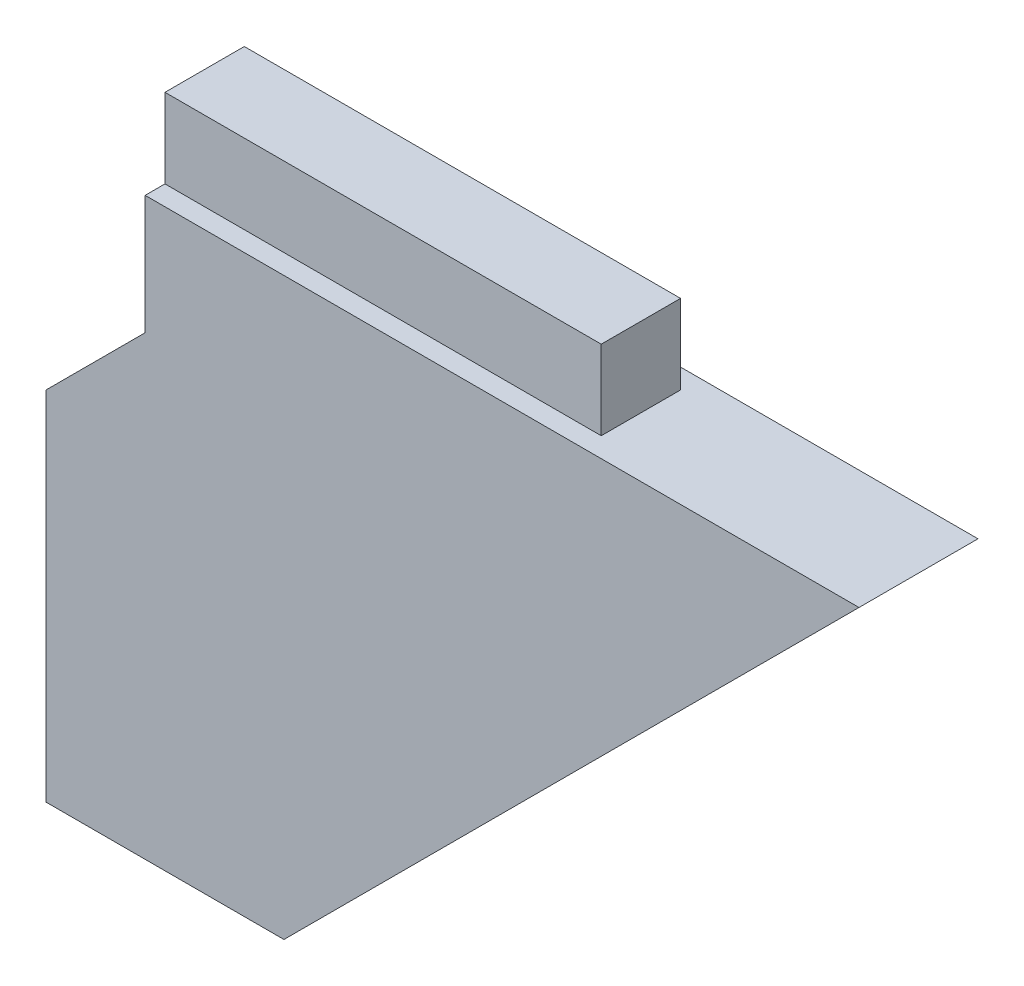
ISO-10303-21;
HEADER;
FILE_DESCRIPTION(('STEP AP214'),'2;1');
FILE_NAME('part.step','',(''),(''),'','','');
FILE_SCHEMA(('AUTOMOTIVE_DESIGN { 1 0 10303 214 1 1 1 1 }'));
ENDSEC;
DATA;
#1=APPLICATION_CONTEXT('core data for automotive mechanical design processes');
#2=APPLICATION_PROTOCOL_DEFINITION('international standard','automotive_design',2000,#1);
#3=PRODUCT_CONTEXT('',#1,'mechanical');
#4=PRODUCT('Part','Part','',(#3));
#5=PRODUCT_RELATED_PRODUCT_CATEGORY('part','',(#4));
#6=PRODUCT_DEFINITION_FORMATION('','',#4);
#7=PRODUCT_DEFINITION_CONTEXT('part definition',#1,'design');
#8=PRODUCT_DEFINITION('design','',#6,#7);
#9=PRODUCT_DEFINITION_SHAPE('','',#8);
#10=(LENGTH_UNIT() NAMED_UNIT(*) SI_UNIT(.MILLI.,.METRE.));
#11=(NAMED_UNIT(*) PLANE_ANGLE_UNIT() SI_UNIT($,.RADIAN.));
#12=(NAMED_UNIT(*) SI_UNIT($,.STERADIAN.) SOLID_ANGLE_UNIT());
#13=UNCERTAINTY_MEASURE_WITH_UNIT(LENGTH_MEASURE(1.E-05),#10,'distance_accuracy_value','');
#14=(GEOMETRIC_REPRESENTATION_CONTEXT(3) GLOBAL_UNCERTAINTY_ASSIGNED_CONTEXT((#13)) GLOBAL_UNIT_ASSIGNED_CONTEXT((#10,
#11,#12)) REPRESENTATION_CONTEXT('',''));
#15=CARTESIAN_POINT('',(0.,0.,0.));
#16=DIRECTION('',(0.,0.,1.));
#17=DIRECTION('',(1.,0.,0.));
#18=AXIS2_PLACEMENT_3D('',#15,#16,#17);
#19=CARTESIAN_POINT('',(0.,-6.00000000000003,1.5));
#20=DIRECTION('',(0.,1.,0.));
#21=DIRECTION('',(-1.,0.,0.));
#22=AXIS2_PLACEMENT_3D('',#19,#20,#21);
#23=PLANE('',#22);
#24=DIRECTION('',(0.,0.,-1.));
#25=VECTOR('',#24,1.);
#26=CARTESIAN_POINT('',(-39.5,-6.00000000000001,1.5));
#27=LINE('',#26,#25);
#28=CARTESIAN_POINT('',(-39.5,-6.00000000000001,-1.));
#29=VERTEX_POINT('',#28);
#30=CARTESIAN_POINT('',(-39.5,-6.00000000000001,-1.5));
#31=VERTEX_POINT('',#30);
#32=EDGE_CURVE('E53',#29,#31,#27,.T.);
#33=ORIENTED_EDGE('',*,*,#32,.F.);
#34=DIRECTION('',(1.,0.,0.));
#35=VECTOR('',#34,1.);
#36=CARTESIAN_POINT('',(0.,-6.,-1.));
#37=LINE('',#36,#35);
#38=CARTESIAN_POINT('',(-28.5,-6.00000000000001,-1.));
#39=VERTEX_POINT('',#38);
#40=EDGE_CURVE('E60',#29,#39,#37,.T.);
#41=ORIENTED_EDGE('',*,*,#40,.T.);
#42=DIRECTION('',(0.,0.,-1.));
#43=VECTOR('',#42,1.);
#44=CARTESIAN_POINT('',(-28.5,-6.00000000000001,1.));
#45=LINE('',#44,#43);
#46=CARTESIAN_POINT('',(-28.5,-6.00000000000001,1.));
#47=VERTEX_POINT('',#46);
#48=EDGE_CURVE('E132',#47,#39,#45,.T.);
#49=ORIENTED_EDGE('',*,*,#48,.F.);
#50=DIRECTION('',(1.,0.,0.));
#51=VECTOR('',#50,1.);
#52=CARTESIAN_POINT('',(0.,-6.,1.));
#53=LINE('',#52,#51);
#54=CARTESIAN_POINT('',(-39.5,-6.00000000000001,1.));
#55=VERTEX_POINT('',#54);
#56=EDGE_CURVE('E141',#55,#47,#53,.T.);
#57=ORIENTED_EDGE('',*,*,#56,.F.);
#58=CARTESIAN_POINT('',(-39.5,-6.00000000000001,1.5));
#59=VERTEX_POINT('',#58);
#60=EDGE_CURVE('E11',#59,#55,#27,.T.);
#61=ORIENTED_EDGE('',*,*,#60,.F.);
#62=DIRECTION('',(1.,0.,0.));
#63=VECTOR('',#62,1.);
#64=CARTESIAN_POINT('',(0.,-6.00000000000003,1.5));
#65=LINE('',#64,#63);
#66=CARTESIAN_POINT('',(-21.5,-6.00000000000001,1.5));
#67=VERTEX_POINT('',#66);
#68=EDGE_CURVE('E169',#59,#67,#65,.T.);
#69=ORIENTED_EDGE('',*,*,#68,.T.);
#70=DIRECTION('',(0.,0.,-1.));
#71=VECTOR('',#70,1.);
#72=CARTESIAN_POINT('',(-21.5,-6.00000000000001,1.5));
#73=LINE('',#72,#71);
#74=CARTESIAN_POINT('',(-21.5,-6.00000000000001,-1.5));
#75=VERTEX_POINT('',#74);
#76=EDGE_CURVE('E189',#67,#75,#73,.T.);
#77=ORIENTED_EDGE('',*,*,#76,.T.);
#78=DIRECTION('',(1.,0.,0.));
#79=VECTOR('',#78,1.);
#80=CARTESIAN_POINT('',(0.,-6.00000000000003,-1.5));
#81=LINE('',#80,#79);
#82=EDGE_CURVE('E131',#31,#75,#81,.T.);
#83=ORIENTED_EDGE('',*,*,#82,.F.);
#84=EDGE_LOOP('',(#33,#41,#49,#57,#61,#69,#77,#83));
#85=FACE_BOUND('',#84,.T.);
#86=ADVANCED_FACE('F45',(#85),#23,.T.);
#87=CARTESIAN_POINT('',(-39.5,0.,1.5));
#88=DIRECTION('',(1.,0.,0.));
#89=DIRECTION('',(0.,1.,0.));
#90=AXIS2_PLACEMENT_3D('',#87,#88,#89);
#91=PLANE('',#90);
#92=DIRECTION('',(0.,-1.,0.));
#93=VECTOR('',#92,1.);
#94=CARTESIAN_POINT('',(-39.5,0.,-1.5));
#95=LINE('',#94,#93);
#96=CARTESIAN_POINT('',(-39.5,-9.00000000000002,-1.5));
#97=VERTEX_POINT('',#96);
#98=EDGE_CURVE('E193',#31,#97,#95,.T.);
#99=ORIENTED_EDGE('',*,*,#98,.T.);
#100=DIRECTION('',(0.,0.,-1.));
#101=VECTOR('',#100,1.);
#102=CARTESIAN_POINT('',(-39.5,-9.00000000000002,1.5));
#103=LINE('',#102,#101);
#104=CARTESIAN_POINT('',(-39.5,-9.00000000000002,1.5));
#105=VERTEX_POINT('',#104);
#106=EDGE_CURVE('E221',#105,#97,#103,.T.);
#107=ORIENTED_EDGE('',*,*,#106,.F.);
#108=DIRECTION('',(0.,-1.,0.));
#109=VECTOR('',#108,1.);
#110=CARTESIAN_POINT('',(-39.5,0.,1.5));
#111=LINE('',#110,#109);
#112=EDGE_CURVE('E173',#59,#105,#111,.T.);
#113=ORIENTED_EDGE('',*,*,#112,.F.);
#114=ORIENTED_EDGE('',*,*,#60,.T.);
#115=DIRECTION('',(0.,-1.,0.));
#116=VECTOR('',#115,1.);
#117=CARTESIAN_POINT('',(-39.5,0.,1.));
#118=LINE('',#117,#116);
#119=CARTESIAN_POINT('',(-39.5,-4.00000000000001,1.));
#120=VERTEX_POINT('',#119);
#121=EDGE_CURVE('E135',#120,#55,#118,.T.);
#122=ORIENTED_EDGE('',*,*,#121,.F.);
#123=DIRECTION('',(0.,0.,-1.));
#124=VECTOR('',#123,1.);
#125=CARTESIAN_POINT('',(-39.5,-4.00000000000001,1.));
#126=LINE('',#125,#124);
#127=CARTESIAN_POINT('',(-39.5,-4.00000000000001,-1.));
#128=VERTEX_POINT('',#127);
#129=EDGE_CURVE('E120',#120,#128,#126,.T.);
#130=ORIENTED_EDGE('',*,*,#129,.T.);
#131=DIRECTION('',(0.,-1.,0.));
#132=VECTOR('',#131,1.);
#133=CARTESIAN_POINT('',(-39.5,0.,-1.));
#134=LINE('',#133,#132);
#135=EDGE_CURVE('E160',#128,#29,#134,.T.);
#136=ORIENTED_EDGE('',*,*,#135,.T.);
#137=ORIENTED_EDGE('',*,*,#32,.T.);
#138=EDGE_LOOP('',(#99,#107,#113,#114,#122,#130,#136,#137));
#139=FACE_BOUND('',#138,.T.);
#140=ADVANCED_FACE('F136',(#139),#91,.F.);
#141=CARTESIAN_POINT('',(-15.25,15.25,1.5));
#142=DIRECTION('',(0.707106781186547,-0.707106781186548,0.));
#143=DIRECTION('',(0.707106781186548,0.707106781186547,0.));
#144=AXIS2_PLACEMENT_3D('',#141,#142,#143);
#145=PLANE('',#144);
#146=DIRECTION('',(-0.707106781186548,-0.707106781186547,0.));
#147=VECTOR('',#146,1.);
#148=CARTESIAN_POINT('',(-15.25,15.25,-1.5));
#149=LINE('',#148,#147);
#150=CARTESIAN_POINT('',(-42.,-11.5,-1.5));
#151=VERTEX_POINT('',#150);
#152=EDGE_CURVE('E196',#97,#151,#149,.T.);
#153=ORIENTED_EDGE('',*,*,#152,.T.);
#154=DIRECTION('',(0.,0.,-1.));
#155=VECTOR('',#154,1.);
#156=CARTESIAN_POINT('',(-42.,-11.5,1.5));
#157=LINE('',#156,#155);
#158=CARTESIAN_POINT('',(-42.,-11.5,1.5));
#159=VERTEX_POINT('',#158);
#160=EDGE_CURVE('E218',#159,#151,#157,.T.);
#161=ORIENTED_EDGE('',*,*,#160,.F.);
#162=DIRECTION('',(-0.707106781186548,-0.707106781186547,0.));
#163=VECTOR('',#162,1.);
#164=CARTESIAN_POINT('',(-15.25,15.25,1.5));
#165=LINE('',#164,#163);
#166=EDGE_CURVE('E177',#105,#159,#165,.T.);
#167=ORIENTED_EDGE('',*,*,#166,.F.);
#168=ORIENTED_EDGE('',*,*,#106,.T.);
#169=EDGE_LOOP('',(#153,#161,#167,#168));
#170=FACE_BOUND('',#169,.T.);
#171=ADVANCED_FACE('F249',(#170),#145,.F.);
#172=CARTESIAN_POINT('',(-42.,0.,1.5));
#173=DIRECTION('',(1.,0.,0.));
#174=DIRECTION('',(0.,1.,0.));
#175=AXIS2_PLACEMENT_3D('',#172,#173,#174);
#176=PLANE('',#175);
#177=DIRECTION('',(0.,-1.,0.));
#178=VECTOR('',#177,1.);
#179=CARTESIAN_POINT('',(-42.,0.,-1.5));
#180=LINE('',#179,#178);
#181=CARTESIAN_POINT('',(-42.,-20.5,-1.5));
#182=VERTEX_POINT('',#181);
#183=EDGE_CURVE('E199',#151,#182,#180,.T.);
#184=ORIENTED_EDGE('',*,*,#183,.T.);
#185=DIRECTION('',(0.,0.,-1.));
#186=VECTOR('',#185,1.);
#187=CARTESIAN_POINT('',(-42.,-20.5,1.5));
#188=LINE('',#187,#186);
#189=CARTESIAN_POINT('',(-42.,-20.5,1.5));
#190=VERTEX_POINT('',#189);
#191=EDGE_CURVE('E214',#190,#182,#188,.T.);
#192=ORIENTED_EDGE('',*,*,#191,.F.);
#193=DIRECTION('',(0.,-1.,0.));
#194=VECTOR('',#193,1.);
#195=CARTESIAN_POINT('',(-42.,0.,1.5));
#196=LINE('',#195,#194);
#197=EDGE_CURVE('E180',#159,#190,#196,.T.);
#198=ORIENTED_EDGE('',*,*,#197,.F.);
#199=ORIENTED_EDGE('',*,*,#160,.T.);
#200=EDGE_LOOP('',(#184,#192,#198,#199));
#201=FACE_BOUND('',#200,.T.);
#202=ADVANCED_FACE('F247',(#201),#176,.F.);
#203=CARTESIAN_POINT('',(0.,-20.5,1.5));
#204=DIRECTION('',(0.,1.,0.));
#205=DIRECTION('',(-1.,0.,0.));
#206=AXIS2_PLACEMENT_3D('',#203,#204,#205);
#207=PLANE('',#206);
#208=DIRECTION('',(1.,0.,0.));
#209=VECTOR('',#208,1.);
#210=CARTESIAN_POINT('',(0.,-20.5,-1.5));
#211=LINE('',#210,#209);
#212=CARTESIAN_POINT('',(-36.,-20.5,-1.5));
#213=VERTEX_POINT('',#212);
#214=EDGE_CURVE('E202',#182,#213,#211,.T.);
#215=ORIENTED_EDGE('',*,*,#214,.T.);
#216=DIRECTION('',(0.,0.,-1.));
#217=VECTOR('',#216,1.);
#218=CARTESIAN_POINT('',(-36.,-20.5,1.5));
#219=LINE('',#218,#217);
#220=CARTESIAN_POINT('',(-36.,-20.5,1.5));
#221=VERTEX_POINT('',#220);
#222=EDGE_CURVE('E210',#221,#213,#219,.T.);
#223=ORIENTED_EDGE('',*,*,#222,.F.);
#224=DIRECTION('',(1.,0.,0.));
#225=VECTOR('',#224,1.);
#226=CARTESIAN_POINT('',(0.,-20.5,1.5));
#227=LINE('',#226,#225);
#228=EDGE_CURVE('E183',#190,#221,#227,.T.);
#229=ORIENTED_EDGE('',*,*,#228,.F.);
#230=ORIENTED_EDGE('',*,*,#191,.T.);
#231=EDGE_LOOP('',(#215,#223,#229,#230));
#232=FACE_BOUND('',#231,.T.);
#233=ADVANCED_FACE('F242',(#232),#207,.F.);
#234=CARTESIAN_POINT('',(-7.74999999999998,7.74999999999999,1.5));
#235=DIRECTION('',(-0.707106781186547,0.707106781186548,0.));
#236=DIRECTION('',(-0.707106781186548,-0.707106781186547,0.));
#237=AXIS2_PLACEMENT_3D('',#234,#235,#236);
#238=PLANE('',#237);
#239=DIRECTION('',(0.707106781186548,0.707106781186547,0.));
#240=VECTOR('',#239,1.);
#241=CARTESIAN_POINT('',(-7.74999999999998,7.74999999999999,-1.5));
#242=LINE('',#241,#240);
#243=EDGE_CURVE('E174',#213,#75,#242,.T.);
#244=ORIENTED_EDGE('',*,*,#243,.T.);
#245=ORIENTED_EDGE('',*,*,#76,.F.);
#246=DIRECTION('',(0.707106781186548,0.707106781186547,0.));
#247=VECTOR('',#246,1.);
#248=CARTESIAN_POINT('',(-7.74999999999998,7.74999999999999,1.5));
#249=LINE('',#248,#247);
#250=EDGE_CURVE('E186',#221,#67,#249,.T.);
#251=ORIENTED_EDGE('',*,*,#250,.F.);
#252=ORIENTED_EDGE('',*,*,#222,.T.);
#253=EDGE_LOOP('',(#244,#245,#251,#252));
#254=FACE_BOUND('',#253,.T.);
#255=ADVANCED_FACE('F238',(#254),#238,.F.);
#256=CARTESIAN_POINT('',(0.,0.,1.5));
#257=DIRECTION('',(0.,0.,1.));
#258=DIRECTION('',(1.,0.,0.));
#259=AXIS2_PLACEMENT_3D('',#256,#257,#258);
#260=PLANE('',#259);
#261=ORIENTED_EDGE('',*,*,#68,.F.);
#262=ORIENTED_EDGE('',*,*,#112,.T.);
#263=ORIENTED_EDGE('',*,*,#166,.T.);
#264=ORIENTED_EDGE('',*,*,#197,.T.);
#265=ORIENTED_EDGE('',*,*,#228,.T.);
#266=ORIENTED_EDGE('',*,*,#250,.T.);
#267=EDGE_LOOP('',(#261,#262,#263,#264,#265,#266));
#268=FACE_BOUND('',#267,.T.);
#269=ADVANCED_FACE('F251',(#268),#260,.T.);
#270=CARTESIAN_POINT('',(0.,0.,-1.5));
#271=DIRECTION('',(0.,0.,1.));
#272=DIRECTION('',(1.,0.,0.));
#273=AXIS2_PLACEMENT_3D('',#270,#271,#272);
#274=PLANE('',#273);
#275=ORIENTED_EDGE('',*,*,#82,.T.);
#276=ORIENTED_EDGE('',*,*,#243,.F.);
#277=ORIENTED_EDGE('',*,*,#214,.F.);
#278=ORIENTED_EDGE('',*,*,#183,.F.);
#279=ORIENTED_EDGE('',*,*,#152,.F.);
#280=ORIENTED_EDGE('',*,*,#98,.F.);
#281=EDGE_LOOP('',(#275,#276,#277,#278,#279,#280));
#282=FACE_BOUND('',#281,.T.);
#283=ADVANCED_FACE('F231',(#282),#274,.F.);
#284=CARTESIAN_POINT('',(0.,-4.00000000000001,1.));
#285=DIRECTION('',(0.,1.,0.));
#286=DIRECTION('',(0.,0.,1.));
#287=AXIS2_PLACEMENT_3D('',#284,#285,#286);
#288=PLANE('',#287);
#289=DIRECTION('',(1.,0.,0.));
#290=VECTOR('',#289,1.);
#291=CARTESIAN_POINT('',(0.,-4.00000000000001,-1.));
#292=LINE('',#291,#290);
#293=CARTESIAN_POINT('',(-28.5,-4.00000000000001,-1.));
#294=VERTEX_POINT('',#293);
#295=EDGE_CURVE('E127',#128,#294,#292,.T.);
#296=ORIENTED_EDGE('',*,*,#295,.F.);
#297=ORIENTED_EDGE('',*,*,#129,.F.);
#298=DIRECTION('',(1.,0.,0.));
#299=VECTOR('',#298,1.);
#300=CARTESIAN_POINT('',(0.,-4.00000000000001,1.));
#301=LINE('',#300,#299);
#302=CARTESIAN_POINT('',(-28.5,-4.00000000000001,1.));
#303=VERTEX_POINT('',#302);
#304=EDGE_CURVE('E124',#120,#303,#301,.T.);
#305=ORIENTED_EDGE('',*,*,#304,.T.);
#306=DIRECTION('',(0.,0.,-1.));
#307=VECTOR('',#306,1.);
#308=CARTESIAN_POINT('',(-28.5,-4.00000000000001,1.));
#309=LINE('',#308,#307);
#310=EDGE_CURVE('E157',#303,#294,#309,.T.);
#311=ORIENTED_EDGE('',*,*,#310,.T.);
#312=EDGE_LOOP('',(#296,#297,#305,#311));
#313=FACE_BOUND('',#312,.T.);
#314=ADVANCED_FACE('F122',(#313),#288,.T.);
#315=CARTESIAN_POINT('',(-28.5,0.,1.));
#316=DIRECTION('',(1.,0.,0.));
#317=DIRECTION('',(0.,1.,0.));
#318=AXIS2_PLACEMENT_3D('',#315,#316,#317);
#319=PLANE('',#318);
#320=DIRECTION('',(0.,-1.,0.));
#321=VECTOR('',#320,1.);
#322=CARTESIAN_POINT('',(-28.5,0.,-1.));
#323=LINE('',#322,#321);
#324=EDGE_CURVE('E147',#294,#39,#323,.T.);
#325=ORIENTED_EDGE('',*,*,#324,.F.);
#326=ORIENTED_EDGE('',*,*,#310,.F.);
#327=DIRECTION('',(0.,-1.,0.));
#328=VECTOR('',#327,1.);
#329=CARTESIAN_POINT('',(-28.5,0.,1.));
#330=LINE('',#329,#328);
#331=EDGE_CURVE('E145',#303,#47,#330,.T.);
#332=ORIENTED_EDGE('',*,*,#331,.T.);
#333=ORIENTED_EDGE('',*,*,#48,.T.);
#334=EDGE_LOOP('',(#325,#326,#332,#333));
#335=FACE_BOUND('',#334,.T.);
#336=ADVANCED_FACE('F314',(#335),#319,.T.);
#337=CARTESIAN_POINT('',(0.,0.,1.));
#338=DIRECTION('',(0.,0.,1.));
#339=DIRECTION('',(1.,0.,0.));
#340=AXIS2_PLACEMENT_3D('',#337,#338,#339);
#341=PLANE('',#340);
#342=ORIENTED_EDGE('',*,*,#304,.F.);
#343=ORIENTED_EDGE('',*,*,#121,.T.);
#344=ORIENTED_EDGE('',*,*,#56,.T.);
#345=ORIENTED_EDGE('',*,*,#331,.F.);
#346=EDGE_LOOP('',(#342,#343,#344,#345));
#347=FACE_BOUND('',#346,.T.);
#348=ADVANCED_FACE('F143',(#347),#341,.T.);
#349=CARTESIAN_POINT('',(0.,0.,-1.));
#350=DIRECTION('',(0.,0.,1.));
#351=DIRECTION('',(1.,0.,0.));
#352=AXIS2_PLACEMENT_3D('',#349,#350,#351);
#353=PLANE('',#352);
#354=ORIENTED_EDGE('',*,*,#295,.T.);
#355=ORIENTED_EDGE('',*,*,#324,.T.);
#356=ORIENTED_EDGE('',*,*,#40,.F.);
#357=ORIENTED_EDGE('',*,*,#135,.F.);
#358=EDGE_LOOP('',(#354,#355,#356,#357));
#359=FACE_BOUND('',#358,.T.);
#360=ADVANCED_FACE('F332',(#359),#353,.F.);
#361=CLOSED_SHELL('',(#86,#140,#171,#202,#233,#255,#269,#283,#314,#336,#348,#360));
#362=MANIFOLD_SOLID_BREP('B2',#361);
#363=ADVANCED_BREP_SHAPE_REPRESENTATION('',(#18,#362),#14);
#364=SHAPE_DEFINITION_REPRESENTATION(#9,#363);
ENDSEC;
END-ISO-10303-21;
